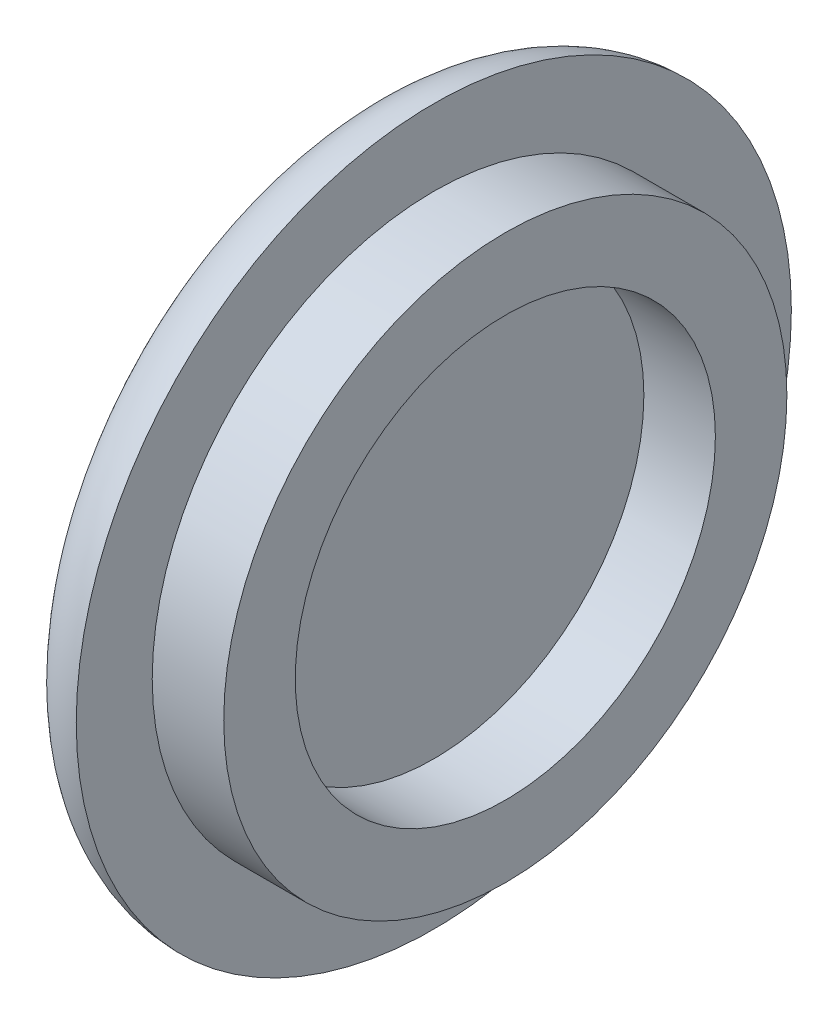
ISO-10303-21;
HEADER;
FILE_DESCRIPTION(('STEP AP214'),'2;1');
FILE_NAME('part.step','',(''),(''),'','','');
FILE_SCHEMA(('AUTOMOTIVE_DESIGN { 1 0 10303 214 1 1 1 1 }'));
ENDSEC;
DATA;
#1=APPLICATION_CONTEXT('core data for automotive mechanical design processes');
#2=APPLICATION_PROTOCOL_DEFINITION('international standard','automotive_design',2000,#1);
#3=PRODUCT_CONTEXT('',#1,'mechanical');
#4=PRODUCT('Part','Part','',(#3));
#5=PRODUCT_RELATED_PRODUCT_CATEGORY('part','',(#4));
#6=PRODUCT_DEFINITION_FORMATION('','',#4);
#7=PRODUCT_DEFINITION_CONTEXT('part definition',#1,'design');
#8=PRODUCT_DEFINITION('design','',#6,#7);
#9=PRODUCT_DEFINITION_SHAPE('','',#8);
#10=(LENGTH_UNIT() NAMED_UNIT(*) SI_UNIT(.MILLI.,.METRE.));
#11=(NAMED_UNIT(*) PLANE_ANGLE_UNIT() SI_UNIT($,.RADIAN.));
#12=(NAMED_UNIT(*) SI_UNIT($,.STERADIAN.) SOLID_ANGLE_UNIT());
#13=UNCERTAINTY_MEASURE_WITH_UNIT(LENGTH_MEASURE(1.E-05),#10,'distance_accuracy_value','');
#14=(GEOMETRIC_REPRESENTATION_CONTEXT(3) GLOBAL_UNCERTAINTY_ASSIGNED_CONTEXT((#13)) GLOBAL_UNIT_ASSIGNED_CONTEXT((#10,
#11,#12)) REPRESENTATION_CONTEXT('',''));
#15=CARTESIAN_POINT('',(0.,0.,0.));
#16=DIRECTION('',(0.,0.,1.));
#17=DIRECTION('',(1.,0.,0.));
#18=AXIS2_PLACEMENT_3D('',#15,#16,#17);
#19=CARTESIAN_POINT('',(2.,0.,0.));
#20=DIRECTION('',(-1.,0.,0.));
#21=DIRECTION('',(0.,0.,1.));
#22=AXIS2_PLACEMENT_3D('',#19,#20,#21);
#23=CYLINDRICAL_SURFACE('',#22,7.875);
#24=CARTESIAN_POINT('',(2.,0.,0.));
#25=DIRECTION('',(1.,0.,0.));
#26=DIRECTION('',(0.,0.,-1.));
#27=AXIS2_PLACEMENT_3D('',#24,#25,#26);
#28=CIRCLE('',#27,7.875);
#29=CARTESIAN_POINT('',(2.,0.,-7.875));
#30=VERTEX_POINT('',#29);
#31=EDGE_CURVE('E40',#30,#30,#28,.T.);
#32=ORIENTED_EDGE('',*,*,#31,.F.);
#33=EDGE_LOOP('',(#32));
#34=FACE_BOUND('',#33,.T.);
#35=CARTESIAN_POINT('',(0.,0.,0.));
#36=DIRECTION('',(1.,0.,0.));
#37=DIRECTION('',(0.,0.,-1.));
#38=AXIS2_PLACEMENT_3D('',#35,#36,#37);
#39=CIRCLE('',#38,7.875);
#40=CARTESIAN_POINT('',(0.,0.,-7.875));
#41=VERTEX_POINT('',#40);
#42=EDGE_CURVE('E44',#41,#41,#39,.T.);
#43=ORIENTED_EDGE('',*,*,#42,.T.);
#44=EDGE_LOOP('',(#43));
#45=FACE_BOUND('',#44,.T.);
#46=ADVANCED_FACE('F33',(#34,#45),#23,.T.);
#47=CARTESIAN_POINT('',(2.,0.,0.));
#48=DIRECTION('',(1.,0.,0.));
#49=DIRECTION('',(0.,0.,-1.));
#50=AXIS2_PLACEMENT_3D('',#47,#48,#49);
#51=PLANE('',#50);
#52=CARTESIAN_POINT('',(2.,0.,0.));
#53=DIRECTION('',(1.,0.,0.));
#54=DIRECTION('',(0.,0.,-1.));
#55=AXIS2_PLACEMENT_3D('',#52,#53,#54);
#56=CIRCLE('',#55,5.875);
#57=CARTESIAN_POINT('',(2.,0.,-5.875));
#58=VERTEX_POINT('',#57);
#59=EDGE_CURVE('E54',#58,#58,#56,.T.);
#60=ORIENTED_EDGE('',*,*,#59,.F.);
#61=EDGE_LOOP('',(#60));
#62=FACE_BOUND('',#61,.T.);
#63=ORIENTED_EDGE('',*,*,#31,.T.);
#64=EDGE_LOOP('',(#63));
#65=FACE_BOUND('',#64,.T.);
#66=ADVANCED_FACE('F68',(#62,#65),#51,.T.);
#67=CARTESIAN_POINT('',(0.,0.,0.));
#68=DIRECTION('',(1.,0.,0.));
#69=DIRECTION('',(0.,0.,-1.));
#70=AXIS2_PLACEMENT_3D('',#67,#68,#69);
#71=PLANE('',#70);
#72=CARTESIAN_POINT('',(0.,0.,0.));
#73=DIRECTION('',(1.,0.,0.));
#74=DIRECTION('',(0.,0.,-1.));
#75=AXIS2_PLACEMENT_3D('',#72,#73,#74);
#76=CIRCLE('',#75,10.);
#77=CARTESIAN_POINT('',(0.,0.,-10.));
#78=VERTEX_POINT('',#77);
#79=EDGE_CURVE('E48',#78,#78,#76,.T.);
#80=ORIENTED_EDGE('',*,*,#79,.T.);
#81=EDGE_LOOP('',(#80));
#82=FACE_BOUND('',#81,.T.);
#83=ORIENTED_EDGE('',*,*,#42,.F.);
#84=EDGE_LOOP('',(#83));
#85=FACE_BOUND('',#84,.T.);
#86=ADVANCED_FACE('F70',(#82,#85),#71,.T.);
#87=CARTESIAN_POINT('',(-2.,0.,0.));
#88=DIRECTION('',(1.,0.,0.));
#89=DIRECTION('',(0.,0.,-1.));
#90=AXIS2_PLACEMENT_3D('',#87,#88,#89);
#91=PLANE('',#90);
#92=CARTESIAN_POINT('',(-2.,0.,0.));
#93=DIRECTION('',(1.,0.,0.));
#94=DIRECTION('',(0.,0.,-1.));
#95=AXIS2_PLACEMENT_3D('',#92,#93,#94);
#96=CIRCLE('',#95,8.);
#97=CARTESIAN_POINT('',(-2.,0.,-8.));
#98=VERTEX_POINT('',#97);
#99=EDGE_CURVE('E10',#98,#98,#96,.F.);
#100=ORIENTED_EDGE('',*,*,#99,.T.);
#101=EDGE_LOOP('',(#100));
#102=FACE_BOUND('',#101,.T.);
#103=ADVANCED_FACE('F76',(#102),#91,.F.);
#104=CARTESIAN_POINT('',(0.,0.,0.));
#105=DIRECTION('',(1.,0.,0.));
#106=DIRECTION('',(0.,0.,-1.));
#107=AXIS2_PLACEMENT_3D('',#104,#105,#106);
#108=TOROIDAL_SURFACE('',#107,8.,2.);
#109=ORIENTED_EDGE('',*,*,#99,.F.);
#110=EDGE_LOOP('',(#109));
#111=FACE_BOUND('',#110,.T.);
#112=ORIENTED_EDGE('',*,*,#79,.F.);
#113=EDGE_LOOP('',(#112));
#114=FACE_BOUND('',#113,.T.);
#115=ADVANCED_FACE('F35',(#111,#114),#108,.T.);
#116=CARTESIAN_POINT('',(0.,0.,0.));
#117=DIRECTION('',(1.,0.,0.));
#118=DIRECTION('',(0.,0.,-1.));
#119=AXIS2_PLACEMENT_3D('',#116,#117,#118);
#120=CYLINDRICAL_SURFACE('',#119,5.875);
#121=CARTESIAN_POINT('',(0.,0.,0.));
#122=DIRECTION('',(1.,0.,0.));
#123=DIRECTION('',(0.,0.,-1.));
#124=AXIS2_PLACEMENT_3D('',#121,#122,#123);
#125=CIRCLE('',#124,5.875);
#126=CARTESIAN_POINT('',(0.,0.,-5.875));
#127=VERTEX_POINT('',#126);
#128=EDGE_CURVE('E53',#127,#127,#125,.T.);
#129=ORIENTED_EDGE('',*,*,#128,.F.);
#130=EDGE_LOOP('',(#129));
#131=FACE_BOUND('',#130,.T.);
#132=ORIENTED_EDGE('',*,*,#59,.T.);
#133=EDGE_LOOP('',(#132));
#134=FACE_BOUND('',#133,.T.);
#135=ADVANCED_FACE('F62',(#131,#134),#120,.F.);
#136=CARTESIAN_POINT('',(0.,0.,0.));
#137=DIRECTION('',(1.,0.,0.));
#138=DIRECTION('',(0.,0.,-1.));
#139=AXIS2_PLACEMENT_3D('',#136,#137,#138);
#140=PLANE('',#139);
#141=ORIENTED_EDGE('',*,*,#128,.T.);
#142=EDGE_LOOP('',(#141));
#143=FACE_BOUND('',#142,.T.);
#144=ADVANCED_FACE('F60',(#143),#140,.T.);
#145=CLOSED_SHELL('',(#46,#66,#86,#103,#115,#135,#144));
#146=MANIFOLD_SOLID_BREP('B2',#145);
#147=ADVANCED_BREP_SHAPE_REPRESENTATION('',(#18,#146),#14);
#148=SHAPE_DEFINITION_REPRESENTATION(#9,#147);
ENDSEC;
END-ISO-10303-21;
